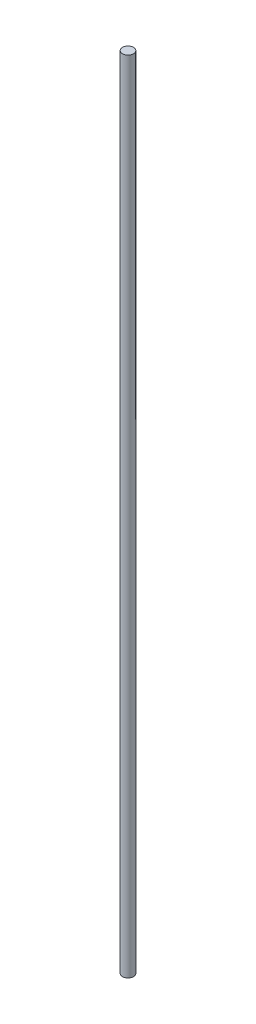
ISO-10303-21;
HEADER;
FILE_DESCRIPTION(('STEP AP214'),'2;1');
FILE_NAME('part.step','',(''),(''),'','','');
FILE_SCHEMA(('AUTOMOTIVE_DESIGN { 1 0 10303 214 1 1 1 1 }'));
ENDSEC;
DATA;
#1=APPLICATION_CONTEXT('core data for automotive mechanical design processes');
#2=APPLICATION_PROTOCOL_DEFINITION('international standard','automotive_design',2000,#1);
#3=PRODUCT_CONTEXT('',#1,'mechanical');
#4=PRODUCT('Part','Part','',(#3));
#5=PRODUCT_RELATED_PRODUCT_CATEGORY('part','',(#4));
#6=PRODUCT_DEFINITION_FORMATION('','',#4);
#7=PRODUCT_DEFINITION_CONTEXT('part definition',#1,'design');
#8=PRODUCT_DEFINITION('design','',#6,#7);
#9=PRODUCT_DEFINITION_SHAPE('','',#8);
#10=(LENGTH_UNIT() NAMED_UNIT(*) SI_UNIT(.MILLI.,.METRE.));
#11=(NAMED_UNIT(*) PLANE_ANGLE_UNIT() SI_UNIT($,.RADIAN.));
#12=(NAMED_UNIT(*) SI_UNIT($,.STERADIAN.) SOLID_ANGLE_UNIT());
#13=UNCERTAINTY_MEASURE_WITH_UNIT(LENGTH_MEASURE(1.E-05),#10,'distance_accuracy_value','');
#14=(GEOMETRIC_REPRESENTATION_CONTEXT(3) GLOBAL_UNCERTAINTY_ASSIGNED_CONTEXT((#13)) GLOBAL_UNIT_ASSIGNED_CONTEXT((#10,
#11,#12)) REPRESENTATION_CONTEXT('',''));
#15=CARTESIAN_POINT('',(0.,0.,0.));
#16=DIRECTION('',(0.,0.,1.));
#17=DIRECTION('',(1.,0.,0.));
#18=AXIS2_PLACEMENT_3D('',#15,#16,#17);
#19=CARTESIAN_POINT('',(0.,720.,0.));
#20=DIRECTION('',(0.,-1.,0.));
#21=DIRECTION('',(0.,0.,-1.));
#22=AXIS2_PLACEMENT_3D('',#19,#20,#21);
#23=CYLINDRICAL_SURFACE('',#22,5.);
#24=CARTESIAN_POINT('',(0.,720.,0.));
#25=DIRECTION('',(0.,1.,0.));
#26=DIRECTION('',(0.,0.,1.));
#27=AXIS2_PLACEMENT_3D('',#24,#25,#26);
#28=CIRCLE('',#27,5.);
#29=CARTESIAN_POINT('',(0.,720.,-5.));
#30=VERTEX_POINT('',#29);
#31=EDGE_CURVE('E10',#30,#30,#28,.T.);
#32=CARTESIAN_POINT('',(0.,0.,0.));
#33=DIRECTION('',(0.,1.,0.));
#34=DIRECTION('',(0.,0.,1.));
#35=AXIS2_PLACEMENT_3D('',#32,#33,#34);
#36=CIRCLE('',#35,5.);
#37=CARTESIAN_POINT('',(0.,-1.11022302462516E-13,-5.));
#38=VERTEX_POINT('',#37);
#39=EDGE_CURVE('E36',#38,#38,#36,.T.);
#40=CARTESIAN_POINT('',(0.,720.,-5.));
#41=CARTESIAN_POINT('',(0.,712.5,-5.));
#42=CARTESIAN_POINT('',(0.,705.,-5.));
#43=CARTESIAN_POINT('',(0.,690.,-5.));
#44=CARTESIAN_POINT('',(0.,682.5,-5.));
#45=CARTESIAN_POINT('',(0.,667.5,-5.));
#46=CARTESIAN_POINT('',(0.,660.,-5.));
#47=CARTESIAN_POINT('',(0.,645.,-5.));
#48=CARTESIAN_POINT('',(0.,637.5,-5.));
#49=CARTESIAN_POINT('',(0.,622.5,-5.));
#50=CARTESIAN_POINT('',(0.,615.,-5.));
#51=CARTESIAN_POINT('',(0.,600.,-5.));
#52=CARTESIAN_POINT('',(0.,592.5,-5.));
#53=CARTESIAN_POINT('',(0.,577.5,-5.));
#54=CARTESIAN_POINT('',(0.,570.,-5.));
#55=CARTESIAN_POINT('',(0.,555.,-5.));
#56=CARTESIAN_POINT('',(0.,547.5,-5.));
#57=CARTESIAN_POINT('',(0.,532.5,-5.));
#58=CARTESIAN_POINT('',(0.,525.,-5.));
#59=CARTESIAN_POINT('',(0.,510.,-5.));
#60=CARTESIAN_POINT('',(0.,502.5,-5.));
#61=CARTESIAN_POINT('',(0.,487.5,-5.));
#62=CARTESIAN_POINT('',(0.,480.,-5.));
#63=CARTESIAN_POINT('',(0.,465.,-5.));
#64=CARTESIAN_POINT('',(0.,457.5,-5.));
#65=CARTESIAN_POINT('',(0.,442.5,-5.));
#66=CARTESIAN_POINT('',(0.,435.,-5.));
#67=CARTESIAN_POINT('',(0.,420.,-5.));
#68=CARTESIAN_POINT('',(0.,412.5,-5.));
#69=CARTESIAN_POINT('',(0.,397.5,-5.));
#70=CARTESIAN_POINT('',(0.,390.,-5.));
#71=CARTESIAN_POINT('',(0.,375.,-5.));
#72=CARTESIAN_POINT('',(0.,367.5,-5.));
#73=CARTESIAN_POINT('',(0.,352.5,-5.));
#74=CARTESIAN_POINT('',(0.,345.,-5.));
#75=CARTESIAN_POINT('',(0.,330.,-5.));
#76=CARTESIAN_POINT('',(0.,322.5,-5.));
#77=CARTESIAN_POINT('',(0.,307.5,-5.));
#78=CARTESIAN_POINT('',(0.,300.,-5.));
#79=CARTESIAN_POINT('',(0.,285.,-5.));
#80=CARTESIAN_POINT('',(0.,277.5,-5.));
#81=CARTESIAN_POINT('',(0.,262.5,-5.));
#82=CARTESIAN_POINT('',(0.,255.,-5.));
#83=CARTESIAN_POINT('',(0.,240.,-5.));
#84=CARTESIAN_POINT('',(0.,232.5,-5.));
#85=CARTESIAN_POINT('',(0.,217.5,-5.));
#86=CARTESIAN_POINT('',(0.,210.,-5.));
#87=CARTESIAN_POINT('',(0.,195.,-5.));
#88=CARTESIAN_POINT('',(0.,187.5,-5.));
#89=CARTESIAN_POINT('',(0.,172.5,-5.));
#90=CARTESIAN_POINT('',(0.,165.,-5.));
#91=CARTESIAN_POINT('',(0.,150.,-5.));
#92=CARTESIAN_POINT('',(0.,142.5,-5.));
#93=CARTESIAN_POINT('',(0.,127.5,-5.));
#94=CARTESIAN_POINT('',(0.,120.,-5.));
#95=CARTESIAN_POINT('',(0.,105.,-5.));
#96=CARTESIAN_POINT('',(0.,97.4999999999999,-5.));
#97=CARTESIAN_POINT('',(0.,82.4999999999999,-5.));
#98=CARTESIAN_POINT('',(0.,74.9999999999999,-5.));
#99=CARTESIAN_POINT('',(0.,59.9999999999999,-5.));
#100=CARTESIAN_POINT('',(0.,52.4999999999999,-5.));
#101=CARTESIAN_POINT('',(0.,37.4999999999999,-5.));
#102=CARTESIAN_POINT('',(0.,29.9999999999999,-5.));
#103=CARTESIAN_POINT('',(0.,14.9999999999999,-5.));
#104=CARTESIAN_POINT('',(0.,7.49999999999989,-5.));
#105=CARTESIAN_POINT('',(0.,-1.11022302462516E-13,-5.));
#106=B_SPLINE_CURVE_WITH_KNOTS('',3,(#40,#41,#42,#43,#44,#45,#46,#47,#48,#49,#50,#51,#52,#53,
#54,#55,#56,#57,#58,#59,#60,#61,#62,#63,#64,#65,#66,#67,#68,#69,#70,#71,#72,#73,#74,#75,#76,#77,
#78,#79,#80,#81,#82,#83,#84,#85,#86,#87,#88,#89,#90,#91,#92,#93,#94,#95,#96,#97,#98,#99,#100,
#101,#102,#103,#104,#105),.UNSPECIFIED.,.F.,.F.,(4,2,2,2,2,2,2,2,2,2,2,2,2,2,2,2,2,2,2,2,2,2,2,
2,2,2,2,2,2,2,2,2,4),(0.,22.5,44.9999999999999,67.4999999999999,90.,112.5,135.,157.5,180.,202.5,
225.,247.5,270.,292.5,315.,337.5,360.,382.5,405.,427.5,450.,472.5,495.,517.5,540.,562.5,585.,
607.5,630.,652.5,675.,697.5,720.),.UNSPECIFIED.);
#107=EDGE_CURVE('BSEAM33',#30,#38,#106,.T.);
#108=ORIENTED_EDGE('',*,*,#31,.F.);
#109=ORIENTED_EDGE('',*,*,#39,.T.);
#110=ORIENTED_EDGE('',*,*,#107,.T.);
#111=ORIENTED_EDGE('',*,*,#107,.F.);
#112=EDGE_LOOP('',(#108,#110,#109,#111));
#113=FACE_BOUND('',#112,.T.);
#114=ADVANCED_FACE('F33',(#113),#23,.T.);
#115=CARTESIAN_POINT('',(0.,720.,0.));
#116=DIRECTION('',(0.,1.,0.));
#117=DIRECTION('',(0.,0.,1.));
#118=AXIS2_PLACEMENT_3D('',#115,#116,#117);
#119=PLANE('',#118);
#120=ORIENTED_EDGE('',*,*,#31,.T.);
#121=EDGE_LOOP('',(#120));
#122=FACE_BOUND('',#121,.T.);
#123=ADVANCED_FACE('F50',(#122),#119,.T.);
#124=CARTESIAN_POINT('',(0.,0.,0.));
#125=DIRECTION('',(0.,1.,0.));
#126=DIRECTION('',(0.,0.,1.));
#127=AXIS2_PLACEMENT_3D('',#124,#125,#126);
#128=PLANE('',#127);
#129=ORIENTED_EDGE('',*,*,#39,.F.);
#130=EDGE_LOOP('',(#129));
#131=FACE_BOUND('',#130,.T.);
#132=ADVANCED_FACE('F48',(#131),#128,.F.);
#133=CLOSED_SHELL('',(#114,#123,#132));
#134=MANIFOLD_SOLID_BREP('B2',#133);
#135=ADVANCED_BREP_SHAPE_REPRESENTATION('',(#18,#134),#14);
#136=SHAPE_DEFINITION_REPRESENTATION(#9,#135);
ENDSEC;
END-ISO-10303-21;
